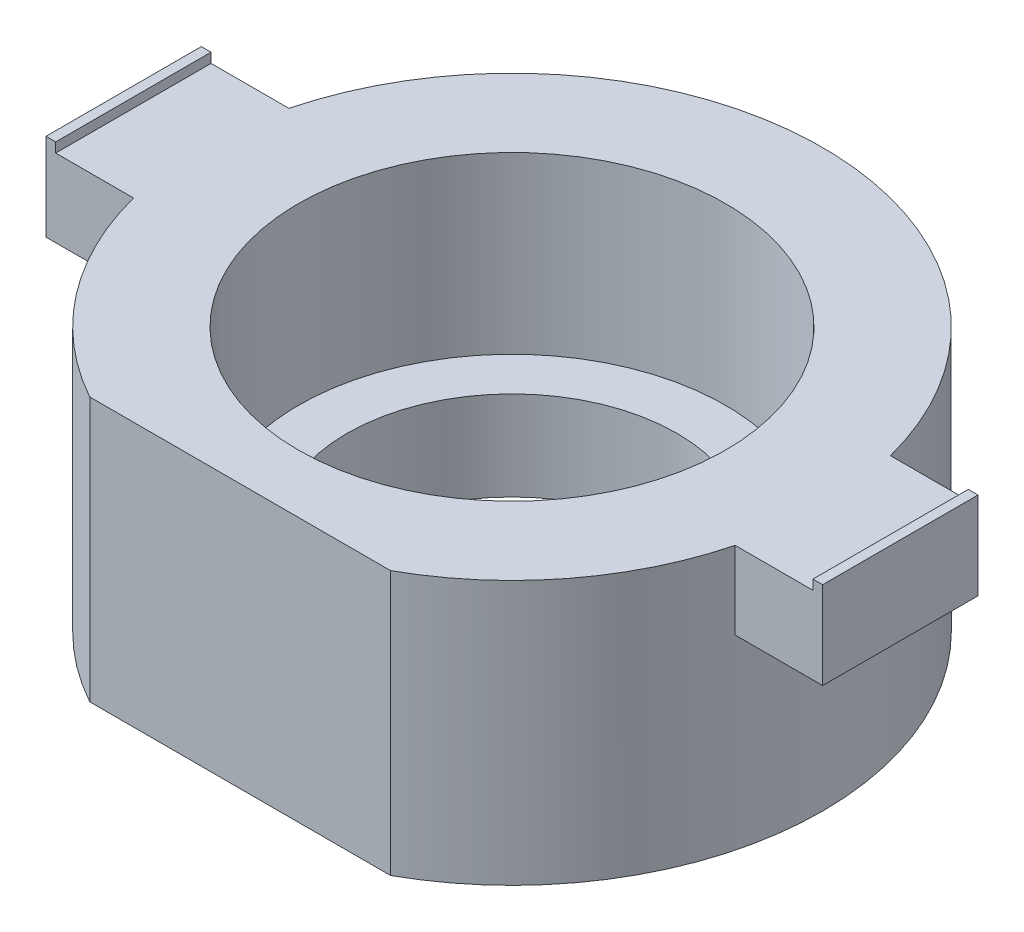
ISO-10303-21;
HEADER;
FILE_DESCRIPTION(('STEP AP214'),'2;1');
FILE_NAME('part.step','',(''),(''),'','','');
FILE_SCHEMA(('AUTOMOTIVE_DESIGN { 1 0 10303 214 1 1 1 1 }'));
ENDSEC;
DATA;
#1=APPLICATION_CONTEXT('core data for automotive mechanical design processes');
#2=APPLICATION_PROTOCOL_DEFINITION('international standard','automotive_design',2000,#1);
#3=PRODUCT_CONTEXT('',#1,'mechanical');
#4=PRODUCT('Part','Part','',(#3));
#5=PRODUCT_RELATED_PRODUCT_CATEGORY('part','',(#4));
#6=PRODUCT_DEFINITION_FORMATION('','',#4);
#7=PRODUCT_DEFINITION_CONTEXT('part definition',#1,'design');
#8=PRODUCT_DEFINITION('design','',#6,#7);
#9=PRODUCT_DEFINITION_SHAPE('','',#8);
#10=(LENGTH_UNIT() NAMED_UNIT(*) SI_UNIT(.MILLI.,.METRE.));
#11=(NAMED_UNIT(*) PLANE_ANGLE_UNIT() SI_UNIT($,.RADIAN.));
#12=(NAMED_UNIT(*) SI_UNIT($,.STERADIAN.) SOLID_ANGLE_UNIT());
#13=UNCERTAINTY_MEASURE_WITH_UNIT(LENGTH_MEASURE(1.E-05),#10,'distance_accuracy_value','');
#14=(GEOMETRIC_REPRESENTATION_CONTEXT(3) GLOBAL_UNCERTAINTY_ASSIGNED_CONTEXT((#13)) GLOBAL_UNIT_ASSIGNED_CONTEXT((#10,
#11,#12)) REPRESENTATION_CONTEXT('',''));
#15=CARTESIAN_POINT('',(0.,0.,0.));
#16=DIRECTION('',(0.,0.,1.));
#17=DIRECTION('',(1.,0.,0.));
#18=AXIS2_PLACEMENT_3D('',#15,#16,#17);
#19=CARTESIAN_POINT('',(8.,6.8,0.));
#20=DIRECTION('',(0.,-1.,0.));
#21=DIRECTION('',(0.,0.,-1.));
#22=AXIS2_PLACEMENT_3D('',#19,#20,#21);
#23=PLANE('',#22);
#24=CARTESIAN_POINT('',(0.,6.8,0.));
#25=DIRECTION('',(0.,1.,0.));
#26=DIRECTION('',(0.,0.,1.));
#27=AXIS2_PLACEMENT_3D('',#24,#25,#26);
#28=CIRCLE('',#27,5.5);
#29=CARTESIAN_POINT('',(0.,6.8,5.5));
#30=VERTEX_POINT('',#29);
#31=EDGE_CURVE('E225',#30,#30,#28,.T.);
#32=ORIENTED_EDGE('',*,*,#31,.F.);
#33=EDGE_LOOP('',(#32));
#34=FACE_BOUND('',#33,.T.);
#35=DIRECTION('',(0.,0.,1.));
#36=VECTOR('',#35,1.);
#37=CARTESIAN_POINT('',(9.75,6.8,2.));
#38=LINE('',#37,#36);
#39=CARTESIAN_POINT('',(9.75,6.8,-2.));
#40=VERTEX_POINT('',#39);
#41=CARTESIAN_POINT('',(9.75,6.8,2.));
#42=VERTEX_POINT('',#41);
#43=EDGE_CURVE('E145',#40,#42,#38,.T.);
#44=ORIENTED_EDGE('',*,*,#43,.F.);
#45=DIRECTION('',(-1.,0.,0.));
#46=VECTOR('',#45,1.);
#47=CARTESIAN_POINT('',(10.,6.8,-2.));
#48=LINE('',#47,#46);
#49=CARTESIAN_POINT('',(7.74596669241483,6.8,-2.));
#50=VERTEX_POINT('',#49);
#51=EDGE_CURVE('E181',#40,#50,#48,.T.);
#52=ORIENTED_EDGE('',*,*,#51,.T.);
#53=CARTESIAN_POINT('',(0.,6.8,0.));
#54=DIRECTION('',(0.,1.,0.));
#55=DIRECTION('',(0.,0.,1.));
#56=AXIS2_PLACEMENT_3D('',#53,#54,#55);
#57=CIRCLE('',#56,8.);
#58=CARTESIAN_POINT('',(-7.74596669241483,6.8,-2.));
#59=VERTEX_POINT('',#58);
#60=EDGE_CURVE('E223',#50,#59,#57,.T.);
#61=ORIENTED_EDGE('',*,*,#60,.T.);
#62=DIRECTION('',(-1.,0.,0.));
#63=VECTOR('',#62,1.);
#64=CARTESIAN_POINT('',(-7.74596669241483,6.8,-2.));
#65=LINE('',#64,#63);
#66=CARTESIAN_POINT('',(-9.75,6.8,-2.));
#67=VERTEX_POINT('',#66);
#68=EDGE_CURVE('E200',#59,#67,#65,.T.);
#69=ORIENTED_EDGE('',*,*,#68,.T.);
#70=DIRECTION('',(0.,0.,-1.));
#71=VECTOR('',#70,1.);
#72=CARTESIAN_POINT('',(-9.75,6.8,-2.));
#73=LINE('',#72,#71);
#74=CARTESIAN_POINT('',(-9.75,6.8,2.));
#75=VERTEX_POINT('',#74);
#76=EDGE_CURVE('E40',#75,#67,#73,.T.);
#77=ORIENTED_EDGE('',*,*,#76,.F.);
#78=DIRECTION('',(1.,0.,0.));
#79=VECTOR('',#78,1.);
#80=CARTESIAN_POINT('',(-7.74596669241483,6.8,2.));
#81=LINE('',#80,#79);
#82=CARTESIAN_POINT('',(-7.74596669241483,6.8,2.));
#83=VERTEX_POINT('',#82);
#84=EDGE_CURVE('E130',#75,#83,#81,.T.);
#85=ORIENTED_EDGE('',*,*,#84,.T.);
#86=CARTESIAN_POINT('',(-3.87298334620742,6.8,7.));
#87=VERTEX_POINT('',#86);
#88=EDGE_CURVE('E224',#83,#87,#57,.T.);
#89=ORIENTED_EDGE('',*,*,#88,.T.);
#90=DIRECTION('',(1.,0.,0.));
#91=VECTOR('',#90,1.);
#92=CARTESIAN_POINT('',(8.,6.8,7.));
#93=LINE('',#92,#91);
#94=CARTESIAN_POINT('',(3.87298334620742,6.8,7.));
#95=VERTEX_POINT('',#94);
#96=EDGE_CURVE('E11',#87,#95,#93,.T.);
#97=ORIENTED_EDGE('',*,*,#96,.T.);
#98=CARTESIAN_POINT('',(7.74596669241483,6.8,2.));
#99=VERTEX_POINT('',#98);
#100=EDGE_CURVE('E221',#95,#99,#57,.T.);
#101=ORIENTED_EDGE('',*,*,#100,.T.);
#102=DIRECTION('',(1.,0.,0.));
#103=VECTOR('',#102,1.);
#104=CARTESIAN_POINT('',(10.,6.8,2.));
#105=LINE('',#104,#103);
#106=EDGE_CURVE('E33',#99,#42,#105,.T.);
#107=ORIENTED_EDGE('',*,*,#106,.T.);
#108=EDGE_LOOP('',(#44,#52,#61,#69,#77,#85,#89,#97,#101,#107));
#109=FACE_BOUND('',#108,.T.);
#110=ADVANCED_FACE('F16',(#34,#109),#23,.F.);
#111=CARTESIAN_POINT('',(0.,0.,0.));
#112=DIRECTION('',(0.,1.,0.));
#113=DIRECTION('',(0.,0.,1.));
#114=AXIS2_PLACEMENT_3D('',#111,#112,#113);
#115=CYLINDRICAL_SURFACE('',#114,4.25);
#116=CARTESIAN_POINT('',(0.,0.,0.));
#117=DIRECTION('',(0.,1.,0.));
#118=DIRECTION('',(0.,0.,1.));
#119=AXIS2_PLACEMENT_3D('',#116,#117,#118);
#120=CIRCLE('',#119,4.25);
#121=CARTESIAN_POINT('',(0.,0.,4.25));
#122=VERTEX_POINT('',#121);
#123=EDGE_CURVE('E25',#122,#122,#120,.T.);
#124=ORIENTED_EDGE('',*,*,#123,.F.);
#125=EDGE_LOOP('',(#124));
#126=FACE_BOUND('',#125,.T.);
#127=CARTESIAN_POINT('',(0.,2.3,0.));
#128=DIRECTION('',(0.,1.,0.));
#129=DIRECTION('',(0.,0.,1.));
#130=AXIS2_PLACEMENT_3D('',#127,#128,#129);
#131=CIRCLE('',#130,4.25);
#132=CARTESIAN_POINT('',(0.,2.3,4.25));
#133=VERTEX_POINT('',#132);
#134=EDGE_CURVE('E231',#133,#133,#131,.T.);
#135=ORIENTED_EDGE('',*,*,#134,.T.);
#136=EDGE_LOOP('',(#135));
#137=FACE_BOUND('',#136,.T.);
#138=ADVANCED_FACE('F18',(#126,#137),#115,.F.);
#139=CARTESIAN_POINT('',(4.25,0.,0.));
#140=DIRECTION('',(0.,1.,0.));
#141=DIRECTION('',(0.,0.,1.));
#142=AXIS2_PLACEMENT_3D('',#139,#140,#141);
#143=PLANE('',#142);
#144=CARTESIAN_POINT('',(0.,0.,0.));
#145=DIRECTION('',(0.,1.,0.));
#146=DIRECTION('',(0.,0.,1.));
#147=AXIS2_PLACEMENT_3D('',#144,#145,#146);
#148=CIRCLE('',#147,8.);
#149=CARTESIAN_POINT('',(3.87298334620742,0.,7.));
#150=VERTEX_POINT('',#149);
#151=CARTESIAN_POINT('',(-3.87298334620742,0.,7.));
#152=VERTEX_POINT('',#151);
#153=EDGE_CURVE('E218',#150,#152,#148,.T.);
#154=ORIENTED_EDGE('',*,*,#153,.F.);
#155=DIRECTION('',(-1.,0.,0.));
#156=VECTOR('',#155,1.);
#157=CARTESIAN_POINT('',(4.25,0.,7.));
#158=LINE('',#157,#156);
#159=EDGE_CURVE('E237',#150,#152,#158,.T.);
#160=ORIENTED_EDGE('',*,*,#159,.T.);
#161=EDGE_LOOP('',(#154,#160));
#162=FACE_BOUND('',#161,.T.);
#163=ORIENTED_EDGE('',*,*,#123,.T.);
#164=EDGE_LOOP('',(#163));
#165=FACE_BOUND('',#164,.T.);
#166=ADVANCED_FACE('F275',(#162,#165),#143,.F.);
#167=CARTESIAN_POINT('',(0.,0.,0.));
#168=DIRECTION('',(0.,1.,0.));
#169=DIRECTION('',(0.,0.,1.));
#170=AXIS2_PLACEMENT_3D('',#167,#168,#169);
#171=CYLINDRICAL_SURFACE('',#170,8.);
#172=CARTESIAN_POINT('',(0.,4.8,0.));
#173=DIRECTION('',(0.,-1.,0.));
#174=DIRECTION('',(0.,0.,1.));
#175=AXIS2_PLACEMENT_3D('',#172,#173,#174);
#176=CIRCLE('',#175,8.);
#177=CARTESIAN_POINT('',(7.74596669241483,4.8,-2.));
#178=VERTEX_POINT('',#177);
#179=CARTESIAN_POINT('',(7.74596669241483,4.8,2.));
#180=VERTEX_POINT('',#179);
#181=EDGE_CURVE('E459',#178,#180,#176,.T.);
#182=ORIENTED_EDGE('',*,*,#181,.T.);
#183=DIRECTION('',(0.,1.,0.));
#184=VECTOR('',#183,1.);
#185=CARTESIAN_POINT('',(7.74596669241483,4.8,2.));
#186=LINE('',#185,#184);
#187=EDGE_CURVE('E131',#180,#99,#186,.T.);
#188=ORIENTED_EDGE('',*,*,#187,.T.);
#189=ORIENTED_EDGE('',*,*,#100,.F.);
#190=DIRECTION('',(0.,1.,0.));
#191=VECTOR('',#190,1.);
#192=CARTESIAN_POINT('',(3.87298334620742,0.,7.));
#193=LINE('',#192,#191);
#194=EDGE_CURVE('E240',#95,#150,#193,.F.);
#195=ORIENTED_EDGE('',*,*,#194,.T.);
#196=ORIENTED_EDGE('',*,*,#153,.T.);
#197=DIRECTION('',(0.,1.,0.));
#198=VECTOR('',#197,1.);
#199=CARTESIAN_POINT('',(-3.87298334620742,0.,7.));
#200=LINE('',#199,#198);
#201=EDGE_CURVE('E234',#152,#87,#200,.T.);
#202=ORIENTED_EDGE('',*,*,#201,.T.);
#203=ORIENTED_EDGE('',*,*,#88,.F.);
#204=DIRECTION('',(0.,1.,0.));
#205=VECTOR('',#204,1.);
#206=CARTESIAN_POINT('',(-7.74596669241484,4.8,2.));
#207=LINE('',#206,#205);
#208=CARTESIAN_POINT('',(-7.74596669241484,4.8,2.));
#209=VERTEX_POINT('',#208);
#210=EDGE_CURVE('E244',#209,#83,#207,.T.);
#211=ORIENTED_EDGE('',*,*,#210,.F.);
#212=CARTESIAN_POINT('',(0.,4.8,0.));
#213=DIRECTION('',(0.,-1.,0.));
#214=DIRECTION('',(0.,0.,1.));
#215=AXIS2_PLACEMENT_3D('',#212,#213,#214);
#216=CIRCLE('',#215,8.);
#217=CARTESIAN_POINT('',(-7.74596669241483,4.8,-2.));
#218=VERTEX_POINT('',#217);
#219=EDGE_CURVE('E203',#209,#218,#216,.T.);
#220=ORIENTED_EDGE('',*,*,#219,.T.);
#221=DIRECTION('',(0.,1.,0.));
#222=VECTOR('',#221,1.);
#223=CARTESIAN_POINT('',(-7.74596669241483,4.8,-2.));
#224=LINE('',#223,#222);
#225=EDGE_CURVE('E246',#218,#59,#224,.T.);
#226=ORIENTED_EDGE('',*,*,#225,.T.);
#227=ORIENTED_EDGE('',*,*,#60,.F.);
#228=DIRECTION('',(0.,1.,0.));
#229=VECTOR('',#228,1.);
#230=CARTESIAN_POINT('',(7.74596669241483,4.8,-2.));
#231=LINE('',#230,#229);
#232=EDGE_CURVE('E193',#178,#50,#231,.T.);
#233=ORIENTED_EDGE('',*,*,#232,.F.);
#234=EDGE_LOOP('',(#182,#188,#189,#195,#196,#202,#203,#211,#220,#226,#227,#233));
#235=FACE_BOUND('',#234,.T.);
#236=ADVANCED_FACE('F272',(#235),#171,.T.);
#237=CARTESIAN_POINT('',(0.,0.,0.));
#238=DIRECTION('',(0.,1.,0.));
#239=DIRECTION('',(0.,0.,1.));
#240=AXIS2_PLACEMENT_3D('',#237,#238,#239);
#241=CYLINDRICAL_SURFACE('',#240,5.5);
#242=CARTESIAN_POINT('',(0.,2.3,0.));
#243=DIRECTION('',(0.,1.,0.));
#244=DIRECTION('',(0.,0.,1.));
#245=AXIS2_PLACEMENT_3D('',#242,#243,#244);
#246=CIRCLE('',#245,5.5);
#247=CARTESIAN_POINT('',(0.,2.3,5.5));
#248=VERTEX_POINT('',#247);
#249=EDGE_CURVE('E228',#248,#248,#246,.T.);
#250=ORIENTED_EDGE('',*,*,#249,.F.);
#251=EDGE_LOOP('',(#250));
#252=FACE_BOUND('',#251,.T.);
#253=ORIENTED_EDGE('',*,*,#31,.T.);
#254=EDGE_LOOP('',(#253));
#255=FACE_BOUND('',#254,.T.);
#256=ADVANCED_FACE('F287',(#252,#255),#241,.F.);
#257=CARTESIAN_POINT('',(5.5,2.3,0.));
#258=DIRECTION('',(0.,-1.,0.));
#259=DIRECTION('',(0.,0.,-1.));
#260=AXIS2_PLACEMENT_3D('',#257,#258,#259);
#261=PLANE('',#260);
#262=ORIENTED_EDGE('',*,*,#134,.F.);
#263=EDGE_LOOP('',(#262));
#264=FACE_BOUND('',#263,.T.);
#265=ORIENTED_EDGE('',*,*,#249,.T.);
#266=EDGE_LOOP('',(#265));
#267=FACE_BOUND('',#266,.T.);
#268=ADVANCED_FACE('F284',(#264,#267),#261,.F.);
#269=CARTESIAN_POINT('',(-5.08800402399086,-1.2,7.));
#270=DIRECTION('',(0.,0.,-1.));
#271=DIRECTION('',(-1.,0.,0.));
#272=AXIS2_PLACEMENT_3D('',#269,#270,#271);
#273=PLANE('',#272);
#274=ORIENTED_EDGE('',*,*,#159,.F.);
#275=ORIENTED_EDGE('',*,*,#194,.F.);
#276=ORIENTED_EDGE('',*,*,#96,.F.);
#277=ORIENTED_EDGE('',*,*,#201,.F.);
#278=EDGE_LOOP('',(#274,#275,#276,#277));
#279=FACE_BOUND('',#278,.T.);
#280=ADVANCED_FACE('F270',(#279),#273,.F.);
#281=CARTESIAN_POINT('',(-10.,4.8,2.));
#282=DIRECTION('',(-1.,0.,0.));
#283=DIRECTION('',(0.,0.,1.));
#284=AXIS2_PLACEMENT_3D('',#281,#282,#283);
#285=PLANE('',#284);
#286=DIRECTION('',(0.,1.,0.));
#287=VECTOR('',#286,1.);
#288=CARTESIAN_POINT('',(-10.,4.8,2.));
#289=LINE('',#288,#287);
#290=CARTESIAN_POINT('',(-10.,4.8,2.));
#291=VERTEX_POINT('',#290);
#292=CARTESIAN_POINT('',(-10.,7.05,2.));
#293=VERTEX_POINT('',#292);
#294=EDGE_CURVE('E208',#291,#293,#289,.T.);
#295=ORIENTED_EDGE('',*,*,#294,.T.);
#296=DIRECTION('',(0.,0.,1.));
#297=VECTOR('',#296,1.);
#298=CARTESIAN_POINT('',(-10.,7.05,-2.));
#299=LINE('',#298,#297);
#300=CARTESIAN_POINT('',(-10.,7.05,-2.));
#301=VERTEX_POINT('',#300);
#302=EDGE_CURVE('E159',#301,#293,#299,.T.);
#303=ORIENTED_EDGE('',*,*,#302,.F.);
#304=DIRECTION('',(0.,1.,0.));
#305=VECTOR('',#304,1.);
#306=CARTESIAN_POINT('',(-10.,4.8,-2.));
#307=LINE('',#306,#305);
#308=CARTESIAN_POINT('',(-10.,4.8,-2.));
#309=VERTEX_POINT('',#308);
#310=EDGE_CURVE('E213',#309,#301,#307,.T.);
#311=ORIENTED_EDGE('',*,*,#310,.F.);
#312=DIRECTION('',(0.,0.,1.));
#313=VECTOR('',#312,1.);
#314=CARTESIAN_POINT('',(-10.,4.8,2.));
#315=LINE('',#314,#313);
#316=EDGE_CURVE('E196',#309,#291,#315,.T.);
#317=ORIENTED_EDGE('',*,*,#316,.T.);
#318=EDGE_LOOP('',(#295,#303,#311,#317));
#319=FACE_BOUND('',#318,.T.);
#320=ADVANCED_FACE('F258',(#319),#285,.T.);
#321=CARTESIAN_POINT('',(-7.74596669241483,4.8,-2.));
#322=DIRECTION('',(0.,0.,-1.));
#323=DIRECTION('',(-1.,0.,0.));
#324=AXIS2_PLACEMENT_3D('',#321,#322,#323);
#325=PLANE('',#324);
#326=ORIENTED_EDGE('',*,*,#68,.F.);
#327=ORIENTED_EDGE('',*,*,#225,.F.);
#328=DIRECTION('',(-1.,0.,0.));
#329=VECTOR('',#328,1.);
#330=CARTESIAN_POINT('',(-7.74596669241483,4.8,-2.));
#331=LINE('',#330,#329);
#332=EDGE_CURVE('E206',#218,#309,#331,.T.);
#333=ORIENTED_EDGE('',*,*,#332,.T.);
#334=ORIENTED_EDGE('',*,*,#310,.T.);
#335=DIRECTION('',(-1.,0.,0.));
#336=VECTOR('',#335,1.);
#337=CARTESIAN_POINT('',(-10.,7.05,-2.));
#338=LINE('',#337,#336);
#339=CARTESIAN_POINT('',(-9.75,7.05,-2.));
#340=VERTEX_POINT('',#339);
#341=EDGE_CURVE('E156',#340,#301,#338,.T.);
#342=ORIENTED_EDGE('',*,*,#341,.F.);
#343=DIRECTION('',(0.,-1.,0.));
#344=VECTOR('',#343,1.);
#345=CARTESIAN_POINT('',(-9.75,7.05,-2.));
#346=LINE('',#345,#344);
#347=EDGE_CURVE('E166',#340,#67,#346,.T.);
#348=ORIENTED_EDGE('',*,*,#347,.T.);
#349=EDGE_LOOP('',(#326,#327,#333,#334,#342,#348));
#350=FACE_BOUND('',#349,.T.);
#351=ADVANCED_FACE('F254',(#350),#325,.T.);
#352=CARTESIAN_POINT('',(-7.74596669241483,4.8,2.));
#353=DIRECTION('',(0.,0.,1.));
#354=DIRECTION('',(1.,0.,0.));
#355=AXIS2_PLACEMENT_3D('',#352,#353,#354);
#356=PLANE('',#355);
#357=ORIENTED_EDGE('',*,*,#84,.F.);
#358=DIRECTION('',(0.,-1.,0.));
#359=VECTOR('',#358,1.);
#360=CARTESIAN_POINT('',(-9.75,7.05,2.));
#361=LINE('',#360,#359);
#362=CARTESIAN_POINT('',(-9.75,7.05,2.));
#363=VERTEX_POINT('',#362);
#364=EDGE_CURVE('E178',#363,#75,#361,.T.);
#365=ORIENTED_EDGE('',*,*,#364,.F.);
#366=DIRECTION('',(1.,0.,0.));
#367=VECTOR('',#366,1.);
#368=CARTESIAN_POINT('',(-10.,7.05,2.));
#369=LINE('',#368,#367);
#370=EDGE_CURVE('E162',#293,#363,#369,.T.);
#371=ORIENTED_EDGE('',*,*,#370,.F.);
#372=ORIENTED_EDGE('',*,*,#294,.F.);
#373=DIRECTION('',(1.,0.,0.));
#374=VECTOR('',#373,1.);
#375=CARTESIAN_POINT('',(-7.74596669241483,4.8,2.));
#376=LINE('',#375,#374);
#377=EDGE_CURVE('E199',#291,#209,#376,.T.);
#378=ORIENTED_EDGE('',*,*,#377,.T.);
#379=ORIENTED_EDGE('',*,*,#210,.T.);
#380=EDGE_LOOP('',(#357,#365,#371,#372,#378,#379));
#381=FACE_BOUND('',#380,.T.);
#382=ADVANCED_FACE('F344',(#381),#356,.T.);
#383=CARTESIAN_POINT('',(0.,4.8,0.));
#384=DIRECTION('',(0.,1.,0.));
#385=DIRECTION('',(0.,0.,1.));
#386=AXIS2_PLACEMENT_3D('',#383,#384,#385);
#387=PLANE('',#386);
#388=ORIENTED_EDGE('',*,*,#316,.F.);
#389=ORIENTED_EDGE('',*,*,#332,.F.);
#390=ORIENTED_EDGE('',*,*,#219,.F.);
#391=ORIENTED_EDGE('',*,*,#377,.F.);
#392=EDGE_LOOP('',(#388,#389,#390,#391));
#393=FACE_BOUND('',#392,.T.);
#394=ADVANCED_FACE('F352',(#393),#387,.F.);
#395=CARTESIAN_POINT('',(10.,4.8,2.));
#396=DIRECTION('',(1.,0.,0.));
#397=DIRECTION('',(0.,0.,-1.));
#398=AXIS2_PLACEMENT_3D('',#395,#396,#397);
#399=PLANE('',#398);
#400=DIRECTION('',(0.,1.,0.));
#401=VECTOR('',#400,1.);
#402=CARTESIAN_POINT('',(10.,4.8,-2.));
#403=LINE('',#402,#401);
#404=CARTESIAN_POINT('',(10.,4.8,-2.));
#405=VERTEX_POINT('',#404);
#406=CARTESIAN_POINT('',(10.,7.05,-2.));
#407=VERTEX_POINT('',#406);
#408=EDGE_CURVE('E136',#405,#407,#403,.T.);
#409=ORIENTED_EDGE('',*,*,#408,.T.);
#410=DIRECTION('',(0.,0.,-1.));
#411=VECTOR('',#410,1.);
#412=CARTESIAN_POINT('',(10.,7.05,2.));
#413=LINE('',#412,#411);
#414=CARTESIAN_POINT('',(10.,7.05,2.));
#415=VERTEX_POINT('',#414);
#416=EDGE_CURVE('E134',#415,#407,#413,.T.);
#417=ORIENTED_EDGE('',*,*,#416,.F.);
#418=DIRECTION('',(0.,1.,0.));
#419=VECTOR('',#418,1.);
#420=CARTESIAN_POINT('',(10.,4.8,2.));
#421=LINE('',#420,#419);
#422=CARTESIAN_POINT('',(10.,4.8,2.));
#423=VERTEX_POINT('',#422);
#424=EDGE_CURVE('E119',#423,#415,#421,.T.);
#425=ORIENTED_EDGE('',*,*,#424,.F.);
#426=DIRECTION('',(0.,0.,-1.));
#427=VECTOR('',#426,1.);
#428=CARTESIAN_POINT('',(10.,4.8,2.));
#429=LINE('',#428,#427);
#430=EDGE_CURVE('E169',#423,#405,#429,.T.);
#431=ORIENTED_EDGE('',*,*,#430,.T.);
#432=EDGE_LOOP('',(#409,#417,#425,#431));
#433=FACE_BOUND('',#432,.T.);
#434=ADVANCED_FACE('F135',(#433),#399,.T.);
#435=CARTESIAN_POINT('',(10.,4.8,2.));
#436=DIRECTION('',(0.,0.,1.));
#437=DIRECTION('',(1.,0.,0.));
#438=AXIS2_PLACEMENT_3D('',#435,#436,#437);
#439=PLANE('',#438);
#440=ORIENTED_EDGE('',*,*,#106,.F.);
#441=ORIENTED_EDGE('',*,*,#187,.F.);
#442=DIRECTION('',(1.,0.,0.));
#443=VECTOR('',#442,1.);
#444=CARTESIAN_POINT('',(10.,4.8,2.));
#445=LINE('',#444,#443);
#446=EDGE_CURVE('E126',#180,#423,#445,.T.);
#447=ORIENTED_EDGE('',*,*,#446,.T.);
#448=ORIENTED_EDGE('',*,*,#424,.T.);
#449=DIRECTION('',(1.,0.,0.));
#450=VECTOR('',#449,1.);
#451=CARTESIAN_POINT('',(9.75,7.05,2.));
#452=LINE('',#451,#450);
#453=CARTESIAN_POINT('',(9.75,7.05,2.));
#454=VERTEX_POINT('',#453);
#455=EDGE_CURVE('E124',#454,#415,#452,.T.);
#456=ORIENTED_EDGE('',*,*,#455,.F.);
#457=DIRECTION('',(0.,-1.,0.));
#458=VECTOR('',#457,1.);
#459=CARTESIAN_POINT('',(9.75,7.05,2.));
#460=LINE('',#459,#458);
#461=EDGE_CURVE('E150',#454,#42,#460,.T.);
#462=ORIENTED_EDGE('',*,*,#461,.T.);
#463=EDGE_LOOP('',(#440,#441,#447,#448,#456,#462));
#464=FACE_BOUND('',#463,.T.);
#465=ADVANCED_FACE('F121',(#464),#439,.T.);
#466=CARTESIAN_POINT('',(10.,4.8,-2.));
#467=DIRECTION('',(0.,0.,-1.));
#468=DIRECTION('',(-1.,0.,0.));
#469=AXIS2_PLACEMENT_3D('',#466,#467,#468);
#470=PLANE('',#469);
#471=ORIENTED_EDGE('',*,*,#51,.F.);
#472=DIRECTION('',(0.,-1.,0.));
#473=VECTOR('',#472,1.);
#474=CARTESIAN_POINT('',(9.75,7.05,-2.));
#475=LINE('',#474,#473);
#476=CARTESIAN_POINT('',(9.75,7.05,-2.));
#477=VERTEX_POINT('',#476);
#478=EDGE_CURVE('E153',#477,#40,#475,.T.);
#479=ORIENTED_EDGE('',*,*,#478,.F.);
#480=DIRECTION('',(-1.,0.,0.));
#481=VECTOR('',#480,1.);
#482=CARTESIAN_POINT('',(9.75,7.05,-2.));
#483=LINE('',#482,#481);
#484=EDGE_CURVE('E139',#407,#477,#483,.T.);
#485=ORIENTED_EDGE('',*,*,#484,.F.);
#486=ORIENTED_EDGE('',*,*,#408,.F.);
#487=DIRECTION('',(-1.,0.,0.));
#488=VECTOR('',#487,1.);
#489=CARTESIAN_POINT('',(10.,4.8,-2.));
#490=LINE('',#489,#488);
#491=EDGE_CURVE('E462',#405,#178,#490,.T.);
#492=ORIENTED_EDGE('',*,*,#491,.T.);
#493=ORIENTED_EDGE('',*,*,#232,.T.);
#494=EDGE_LOOP('',(#471,#479,#485,#486,#492,#493));
#495=FACE_BOUND('',#494,.T.);
#496=ADVANCED_FACE('F376',(#495),#470,.T.);
#497=CARTESIAN_POINT('',(0.,4.8,0.));
#498=DIRECTION('',(0.,1.,0.));
#499=DIRECTION('',(0.,0.,1.));
#500=AXIS2_PLACEMENT_3D('',#497,#498,#499);
#501=PLANE('',#500);
#502=ORIENTED_EDGE('',*,*,#430,.F.);
#503=ORIENTED_EDGE('',*,*,#446,.F.);
#504=ORIENTED_EDGE('',*,*,#181,.F.);
#505=ORIENTED_EDGE('',*,*,#491,.F.);
#506=EDGE_LOOP('',(#502,#503,#504,#505));
#507=FACE_BOUND('',#506,.T.);
#508=ADVANCED_FACE('F384',(#507),#501,.F.);
#509=CARTESIAN_POINT('',(-9.75,7.05,-2.));
#510=DIRECTION('',(-1.,0.,0.));
#511=DIRECTION('',(0.,0.,1.));
#512=AXIS2_PLACEMENT_3D('',#509,#510,#511);
#513=PLANE('',#512);
#514=ORIENTED_EDGE('',*,*,#76,.T.);
#515=ORIENTED_EDGE('',*,*,#347,.F.);
#516=DIRECTION('',(0.,0.,-1.));
#517=VECTOR('',#516,1.);
#518=CARTESIAN_POINT('',(-9.75,7.05,-2.));
#519=LINE('',#518,#517);
#520=EDGE_CURVE('E164',#363,#340,#519,.T.);
#521=ORIENTED_EDGE('',*,*,#520,.F.);
#522=ORIENTED_EDGE('',*,*,#364,.T.);
#523=EDGE_LOOP('',(#514,#515,#521,#522));
#524=FACE_BOUND('',#523,.T.);
#525=ADVANCED_FACE('F263',(#524),#513,.F.);
#526=CARTESIAN_POINT('',(0.,7.05,0.));
#527=DIRECTION('',(0.,-1.,0.));
#528=DIRECTION('',(0.,0.,-1.));
#529=AXIS2_PLACEMENT_3D('',#526,#527,#528);
#530=PLANE('',#529);
#531=ORIENTED_EDGE('',*,*,#341,.T.);
#532=ORIENTED_EDGE('',*,*,#302,.T.);
#533=ORIENTED_EDGE('',*,*,#370,.T.);
#534=ORIENTED_EDGE('',*,*,#520,.T.);
#535=EDGE_LOOP('',(#531,#532,#533,#534));
#536=FACE_BOUND('',#535,.T.);
#537=ADVANCED_FACE('F261',(#536),#530,.F.);
#538=CARTESIAN_POINT('',(9.75,7.05,2.));
#539=DIRECTION('',(1.,0.,0.));
#540=DIRECTION('',(0.,0.,-1.));
#541=AXIS2_PLACEMENT_3D('',#538,#539,#540);
#542=PLANE('',#541);
#543=ORIENTED_EDGE('',*,*,#43,.T.);
#544=ORIENTED_EDGE('',*,*,#461,.F.);
#545=DIRECTION('',(0.,0.,1.));
#546=VECTOR('',#545,1.);
#547=CARTESIAN_POINT('',(9.75,7.05,2.));
#548=LINE('',#547,#546);
#549=EDGE_CURVE('E143',#477,#454,#548,.T.);
#550=ORIENTED_EDGE('',*,*,#549,.F.);
#551=ORIENTED_EDGE('',*,*,#478,.T.);
#552=EDGE_LOOP('',(#543,#544,#550,#551));
#553=FACE_BOUND('',#552,.T.);
#554=ADVANCED_FACE('F408',(#553),#542,.F.);
#555=CARTESIAN_POINT('',(0.,7.05,0.));
#556=DIRECTION('',(0.,1.,0.));
#557=DIRECTION('',(0.,0.,1.));
#558=AXIS2_PLACEMENT_3D('',#555,#556,#557);
#559=PLANE('',#558);
#560=ORIENTED_EDGE('',*,*,#455,.T.);
#561=ORIENTED_EDGE('',*,*,#416,.T.);
#562=ORIENTED_EDGE('',*,*,#484,.T.);
#563=ORIENTED_EDGE('',*,*,#549,.T.);
#564=EDGE_LOOP('',(#560,#561,#562,#563));
#565=FACE_BOUND('',#564,.T.);
#566=ADVANCED_FACE('F141',(#565),#559,.T.);
#567=CLOSED_SHELL('',(#110,#138,#166,#236,#256,#268,#280,#320,#351,#382,#394,#434,#465,#496,
#508,#525,#537,#554,#566));
#568=MANIFOLD_SOLID_BREP('B1',#567);
#569=ADVANCED_BREP_SHAPE_REPRESENTATION('',(#18,#568),#14);
#570=SHAPE_DEFINITION_REPRESENTATION(#9,#569);
ENDSEC;
END-ISO-10303-21;
